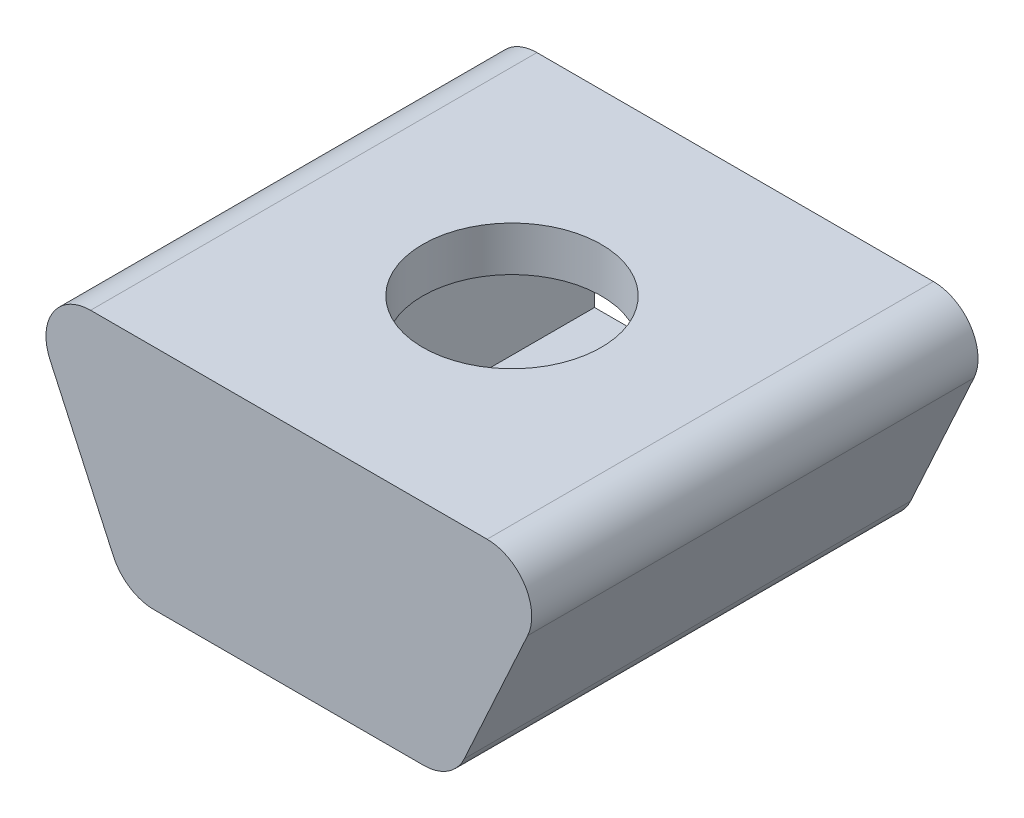
ISO-10303-21;
HEADER;
FILE_DESCRIPTION(('STEP AP214'),'2;1');
FILE_NAME('part.step','',(''),(''),'','','');
FILE_SCHEMA(('AUTOMOTIVE_DESIGN { 1 0 10303 214 1 1 1 1 }'));
ENDSEC;
DATA;
#1=APPLICATION_CONTEXT('core data for automotive mechanical design processes');
#2=APPLICATION_PROTOCOL_DEFINITION('international standard','automotive_design',2000,#1);
#3=PRODUCT_CONTEXT('',#1,'mechanical');
#4=PRODUCT('Part','Part','',(#3));
#5=PRODUCT_RELATED_PRODUCT_CATEGORY('part','',(#4));
#6=PRODUCT_DEFINITION_FORMATION('','',#4);
#7=PRODUCT_DEFINITION_CONTEXT('part definition',#1,'design');
#8=PRODUCT_DEFINITION('design','',#6,#7);
#9=PRODUCT_DEFINITION_SHAPE('','',#8);
#10=(LENGTH_UNIT() NAMED_UNIT(*) SI_UNIT(.MILLI.,.METRE.));
#11=(NAMED_UNIT(*) PLANE_ANGLE_UNIT() SI_UNIT($,.RADIAN.));
#12=(NAMED_UNIT(*) SI_UNIT($,.STERADIAN.) SOLID_ANGLE_UNIT());
#13=UNCERTAINTY_MEASURE_WITH_UNIT(LENGTH_MEASURE(1.E-05),#10,'distance_accuracy_value','');
#14=(GEOMETRIC_REPRESENTATION_CONTEXT(3) GLOBAL_UNCERTAINTY_ASSIGNED_CONTEXT((#13)) GLOBAL_UNIT_ASSIGNED_CONTEXT((#10,
#11,#12)) REPRESENTATION_CONTEXT('',''));
#15=CARTESIAN_POINT('',(0.,0.,0.));
#16=DIRECTION('',(0.,0.,1.));
#17=DIRECTION('',(1.,0.,0.));
#18=AXIS2_PLACEMENT_3D('',#15,#16,#17);
#19=CARTESIAN_POINT('',(-6.,2.65,-8.));
#20=DIRECTION('',(-0.909128622799582,-0.416515482553212,0.));
#21=DIRECTION('',(0.416515482553212,-0.909128622799582,0.));
#22=AXIS2_PLACEMENT_3D('',#19,#20,#21);
#23=PLANE('',#22);
#24=DIRECTION('',(0.416515482553212,-0.909128622799582,0.));
#25=VECTOR('',#24,1.);
#26=CARTESIAN_POINT('',(-6.,2.65,-8.));
#27=LINE('',#26,#25);
#28=CARTESIAN_POINT('',(-5.35102622999275,1.23348451744679,-8.));
#29=VERTEX_POINT('',#28);
#30=CARTESIAN_POINT('',(-3.93076735403873,-1.86651548255321,-8.));
#31=VERTEX_POINT('',#30);
#32=EDGE_CURVE('E158',#29,#31,#27,.T.);
#33=ORIENTED_EDGE('',*,*,#32,.T.);
#34=DIRECTION('',(0.,0.,1.));
#35=VECTOR('',#34,1.);
#36=CARTESIAN_POINT('',(-3.93076735403873,-1.86651548255321,-8.));
#37=LINE('',#36,#35);
#38=CARTESIAN_POINT('',(-3.93076735403873,-1.86651548255321,2.));
#39=VERTEX_POINT('',#38);
#40=EDGE_CURVE('E171',#31,#39,#37,.T.);
#41=ORIENTED_EDGE('',*,*,#40,.T.);
#42=DIRECTION('',(0.416515482553212,-0.909128622799582,0.));
#43=VECTOR('',#42,1.);
#44=CARTESIAN_POINT('',(-6.,2.65,2.));
#45=LINE('',#44,#43);
#46=CARTESIAN_POINT('',(-5.35102622999275,1.23348451744679,2.));
#47=VERTEX_POINT('',#46);
#48=EDGE_CURVE('E219',#47,#39,#45,.T.);
#49=ORIENTED_EDGE('',*,*,#48,.F.);
#50=DIRECTION('',(0.,0.,1.));
#51=VECTOR('',#50,1.);
#52=CARTESIAN_POINT('',(-5.35102622999275,1.23348451744679,-8.));
#53=LINE('',#52,#51);
#54=EDGE_CURVE('E169',#47,#29,#53,.F.);
#55=ORIENTED_EDGE('',*,*,#54,.T.);
#56=EDGE_LOOP('',(#33,#41,#49,#55));
#57=FACE_BOUND('',#56,.T.);
#58=ADVANCED_FACE('F33',(#57),#23,.T.);
#59=CARTESIAN_POINT('',(-6.,2.65,-8.));
#60=DIRECTION('',(0.,1.,0.));
#61=DIRECTION('',(-1.,0.,0.));
#62=AXIS2_PLACEMENT_3D('',#59,#60,#61);
#63=PLANE('',#62);
#64=CARTESIAN_POINT('',(0.,2.65,-3.));
#65=DIRECTION('',(0.,1.,0.));
#66=DIRECTION('',(-1.,0.,0.));
#67=AXIS2_PLACEMENT_3D('',#64,#65,#66);
#68=CIRCLE('',#67,2.);
#69=CARTESIAN_POINT('',(-2.,2.65,-3.));
#70=VERTEX_POINT('',#69);
#71=EDGE_CURVE('E277',#70,#70,#68,.T.);
#72=ORIENTED_EDGE('',*,*,#71,.F.);
#73=EDGE_LOOP('',(#72));
#74=FACE_BOUND('',#73,.T.);
#75=DIRECTION('',(-1.,0.,0.));
#76=VECTOR('',#75,1.);
#77=CARTESIAN_POINT('',(-6.,2.65,-8.));
#78=LINE('',#77,#76);
#79=CARTESIAN_POINT('',(4.44189760719316,2.65,-8.));
#80=VERTEX_POINT('',#79);
#81=CARTESIAN_POINT('',(-4.44189760719316,2.65,-8.));
#82=VERTEX_POINT('',#81);
#83=EDGE_CURVE('E166',#80,#82,#78,.T.);
#84=ORIENTED_EDGE('',*,*,#83,.T.);
#85=DIRECTION('',(0.,0.,1.));
#86=VECTOR('',#85,1.);
#87=CARTESIAN_POINT('',(-4.44189760719316,2.65,-8.));
#88=LINE('',#87,#86);
#89=CARTESIAN_POINT('',(-4.44189760719316,2.65,2.));
#90=VERTEX_POINT('',#89);
#91=EDGE_CURVE('E11',#82,#90,#88,.T.);
#92=ORIENTED_EDGE('',*,*,#91,.T.);
#93=DIRECTION('',(1.,0.,0.));
#94=VECTOR('',#93,1.);
#95=CARTESIAN_POINT('',(-6.,2.65,2.));
#96=LINE('',#95,#94);
#97=CARTESIAN_POINT('',(4.44189760719316,2.65,2.));
#98=VERTEX_POINT('',#97);
#99=EDGE_CURVE('E142',#90,#98,#96,.T.);
#100=ORIENTED_EDGE('',*,*,#99,.T.);
#101=DIRECTION('',(0.,0.,1.));
#102=VECTOR('',#101,1.);
#103=CARTESIAN_POINT('',(4.44189760719316,2.65,-8.));
#104=LINE('',#103,#102);
#105=EDGE_CURVE('E41',#98,#80,#104,.F.);
#106=ORIENTED_EDGE('',*,*,#105,.T.);
#107=EDGE_LOOP('',(#84,#92,#100,#106));
#108=FACE_BOUND('',#107,.T.);
#109=ADVANCED_FACE('F200',(#74,#108),#63,.T.);
#110=CARTESIAN_POINT('',(3.66344507504339,-2.45,-8.));
#111=DIRECTION('',(0.909128622799582,-0.416515482553212,0.));
#112=DIRECTION('',(0.416515482553212,0.909128622799582,0.));
#113=AXIS2_PLACEMENT_3D('',#110,#111,#112);
#114=PLANE('',#113);
#115=DIRECTION('',(0.416515482553212,0.909128622799582,0.));
#116=VECTOR('',#115,1.);
#117=CARTESIAN_POINT('',(3.66344507504339,-2.45,2.));
#118=LINE('',#117,#116);
#119=CARTESIAN_POINT('',(3.93076735403873,-1.86651548255321,2.));
#120=VERTEX_POINT('',#119);
#121=CARTESIAN_POINT('',(5.35102622999275,1.23348451744679,2.));
#122=VERTEX_POINT('',#121);
#123=EDGE_CURVE('E211',#120,#122,#118,.T.);
#124=ORIENTED_EDGE('',*,*,#123,.F.);
#125=DIRECTION('',(0.,0.,1.));
#126=VECTOR('',#125,1.);
#127=CARTESIAN_POINT('',(3.93076735403873,-1.86651548255321,-8.));
#128=LINE('',#127,#126);
#129=CARTESIAN_POINT('',(3.93076735403873,-1.86651548255321,-8.));
#130=VERTEX_POINT('',#129);
#131=EDGE_CURVE('E55',#120,#130,#128,.F.);
#132=ORIENTED_EDGE('',*,*,#131,.T.);
#133=DIRECTION('',(0.416515482553212,0.909128622799582,0.));
#134=VECTOR('',#133,1.);
#135=CARTESIAN_POINT('',(3.66344507504339,-2.45,-8.));
#136=LINE('',#135,#134);
#137=CARTESIAN_POINT('',(5.35102622999275,1.23348451744679,-8.));
#138=VERTEX_POINT('',#137);
#139=EDGE_CURVE('E164',#130,#138,#136,.T.);
#140=ORIENTED_EDGE('',*,*,#139,.T.);
#141=DIRECTION('',(0.,0.,1.));
#142=VECTOR('',#141,1.);
#143=CARTESIAN_POINT('',(5.35102622999275,1.23348451744679,-8.));
#144=LINE('',#143,#142);
#145=EDGE_CURVE('E194',#138,#122,#144,.T.);
#146=ORIENTED_EDGE('',*,*,#145,.T.);
#147=EDGE_LOOP('',(#124,#132,#140,#146));
#148=FACE_BOUND('',#147,.T.);
#149=ADVANCED_FACE('F210',(#148),#114,.T.);
#150=CARTESIAN_POINT('',(-3.66344507504339,-2.45,-8.));
#151=DIRECTION('',(0.,-1.,0.));
#152=DIRECTION('',(1.,0.,0.));
#153=AXIS2_PLACEMENT_3D('',#150,#151,#152);
#154=PLANE('',#153);
#155=DIRECTION('',(1.,0.,0.));
#156=VECTOR('',#155,1.);
#157=CARTESIAN_POINT('',(-3.66344507504339,-2.45,2.));
#158=LINE('',#157,#156);
#159=CARTESIAN_POINT('',(-3.02163873123915,-2.45,2.));
#160=VERTEX_POINT('',#159);
#161=CARTESIAN_POINT('',(3.02163873123915,-2.45,2.));
#162=VERTEX_POINT('',#161);
#163=EDGE_CURVE('E216',#160,#162,#158,.T.);
#164=ORIENTED_EDGE('',*,*,#163,.F.);
#165=DIRECTION('',(0.,0.,1.));
#166=VECTOR('',#165,1.);
#167=CARTESIAN_POINT('',(-3.02163873123915,-2.45,-8.));
#168=LINE('',#167,#166);
#169=CARTESIAN_POINT('',(-3.02163873123915,-2.45,-8.));
#170=VERTEX_POINT('',#169);
#171=EDGE_CURVE('E185',#160,#170,#168,.F.);
#172=ORIENTED_EDGE('',*,*,#171,.T.);
#173=DIRECTION('',(1.,0.,0.));
#174=VECTOR('',#173,1.);
#175=CARTESIAN_POINT('',(-3.66344507504339,-2.45,-8.));
#176=LINE('',#175,#174);
#177=CARTESIAN_POINT('',(3.02163873123915,-2.45,-8.));
#178=VERTEX_POINT('',#177);
#179=EDGE_CURVE('E161',#170,#178,#176,.T.);
#180=ORIENTED_EDGE('',*,*,#179,.T.);
#181=DIRECTION('',(0.,0.,1.));
#182=VECTOR('',#181,1.);
#183=CARTESIAN_POINT('',(3.02163873123915,-2.45,-8.));
#184=LINE('',#183,#182);
#185=EDGE_CURVE('E182',#178,#162,#184,.T.);
#186=ORIENTED_EDGE('',*,*,#185,.T.);
#187=EDGE_LOOP('',(#164,#172,#180,#186));
#188=FACE_BOUND('',#187,.T.);
#189=ADVANCED_FACE('F239',(#188),#154,.T.);
#190=CARTESIAN_POINT('',(0.,0.,-8.));
#191=DIRECTION('',(0.,0.,1.));
#192=DIRECTION('',(1.,0.,0.));
#193=AXIS2_PLACEMENT_3D('',#190,#191,#192);
#194=PLANE('',#193);
#195=DIRECTION('',(1.,0.,0.));
#196=VECTOR('',#195,1.);
#197=CARTESIAN_POINT('',(-3.15,-1.65,-8.));
#198=LINE('',#197,#196);
#199=CARTESIAN_POINT('',(-3.15,-1.65,-8.));
#200=VERTEX_POINT('',#199);
#201=CARTESIAN_POINT('',(3.15,-1.65,-8.));
#202=VERTEX_POINT('',#201);
#203=EDGE_CURVE('E149',#200,#202,#198,.T.);
#204=ORIENTED_EDGE('',*,*,#203,.T.);
#205=DIRECTION('',(0.,1.,0.));
#206=VECTOR('',#205,1.);
#207=CARTESIAN_POINT('',(3.15,-1.65,-8.));
#208=LINE('',#207,#206);
#209=CARTESIAN_POINT('',(3.15,1.65,-8.));
#210=VERTEX_POINT('',#209);
#211=EDGE_CURVE('E223',#202,#210,#208,.T.);
#212=ORIENTED_EDGE('',*,*,#211,.T.);
#213=DIRECTION('',(-1.,0.,0.));
#214=VECTOR('',#213,1.);
#215=CARTESIAN_POINT('',(-3.15,1.65,-8.));
#216=LINE('',#215,#214);
#217=CARTESIAN_POINT('',(-3.15,1.65,-8.));
#218=VERTEX_POINT('',#217);
#219=EDGE_CURVE('E146',#210,#218,#216,.T.);
#220=ORIENTED_EDGE('',*,*,#219,.T.);
#221=DIRECTION('',(0.,-1.,0.));
#222=VECTOR('',#221,1.);
#223=CARTESIAN_POINT('',(-3.15,-1.65,-8.));
#224=LINE('',#223,#222);
#225=EDGE_CURVE('E154',#218,#200,#224,.T.);
#226=ORIENTED_EDGE('',*,*,#225,.T.);
#227=EDGE_LOOP('',(#204,#212,#220,#226));
#228=FACE_BOUND('',#227,.T.);
#229=ORIENTED_EDGE('',*,*,#179,.F.);
#230=CARTESIAN_POINT('',(-3.02163873123915,-1.45,-8.));
#231=DIRECTION('',(0.,0.,1.));
#232=DIRECTION('',(1.,0.,0.));
#233=AXIS2_PLACEMENT_3D('',#230,#231,#232);
#234=CIRCLE('',#233,1.);
#235=EDGE_CURVE('E192',#170,#31,#234,.F.);
#236=ORIENTED_EDGE('',*,*,#235,.T.);
#237=ORIENTED_EDGE('',*,*,#32,.F.);
#238=CARTESIAN_POINT('',(-4.44189760719316,1.65,-8.));
#239=DIRECTION('',(0.,0.,1.));
#240=DIRECTION('',(1.,0.,0.));
#241=AXIS2_PLACEMENT_3D('',#238,#239,#240);
#242=CIRCLE('',#241,1.);
#243=EDGE_CURVE('E188',#29,#82,#242,.F.);
#244=ORIENTED_EDGE('',*,*,#243,.T.);
#245=ORIENTED_EDGE('',*,*,#83,.F.);
#246=CARTESIAN_POINT('',(4.44189760719316,1.65,-8.));
#247=DIRECTION('',(0.,0.,1.));
#248=DIRECTION('',(1.,0.,0.));
#249=AXIS2_PLACEMENT_3D('',#246,#247,#248);
#250=CIRCLE('',#249,1.);
#251=EDGE_CURVE('E48',#80,#138,#250,.F.);
#252=ORIENTED_EDGE('',*,*,#251,.T.);
#253=ORIENTED_EDGE('',*,*,#139,.F.);
#254=CARTESIAN_POINT('',(3.02163873123915,-1.45,-8.));
#255=DIRECTION('',(0.,0.,1.));
#256=DIRECTION('',(1.,0.,0.));
#257=AXIS2_PLACEMENT_3D('',#254,#255,#256);
#258=CIRCLE('',#257,1.);
#259=EDGE_CURVE('E190',#130,#178,#258,.F.);
#260=ORIENTED_EDGE('',*,*,#259,.T.);
#261=EDGE_LOOP('',(#229,#236,#237,#244,#245,#252,#253,#260));
#262=FACE_BOUND('',#261,.T.);
#263=ADVANCED_FACE('F205',(#228,#262),#194,.F.);
#264=CARTESIAN_POINT('',(3.15,-1.65,-8.));
#265=DIRECTION('',(1.,0.,0.));
#266=DIRECTION('',(0.,1.,0.));
#267=AXIS2_PLACEMENT_3D('',#264,#265,#266);
#268=PLANE('',#267);
#269=DIRECTION('',(0.,1.,0.));
#270=VECTOR('',#269,1.);
#271=CARTESIAN_POINT('',(3.15,-1.65,0.));
#272=LINE('',#271,#270);
#273=CARTESIAN_POINT('',(3.15,-1.65,0.));
#274=VERTEX_POINT('',#273);
#275=CARTESIAN_POINT('',(3.15,1.65,0.));
#276=VERTEX_POINT('',#275);
#277=EDGE_CURVE('E126',#274,#276,#272,.T.);
#278=ORIENTED_EDGE('',*,*,#277,.T.);
#279=DIRECTION('',(0.,0.,1.));
#280=VECTOR('',#279,1.);
#281=CARTESIAN_POINT('',(3.15,1.65,-8.));
#282=LINE('',#281,#280);
#283=EDGE_CURVE('E138',#210,#276,#282,.T.);
#284=ORIENTED_EDGE('',*,*,#283,.F.);
#285=ORIENTED_EDGE('',*,*,#211,.F.);
#286=DIRECTION('',(0.,0.,1.));
#287=VECTOR('',#286,1.);
#288=CARTESIAN_POINT('',(3.15,-1.65,-8.));
#289=LINE('',#288,#287);
#290=EDGE_CURVE('E140',#202,#274,#289,.T.);
#291=ORIENTED_EDGE('',*,*,#290,.T.);
#292=EDGE_LOOP('',(#278,#284,#285,#291));
#293=FACE_BOUND('',#292,.T.);
#294=ADVANCED_FACE('F136',(#293),#268,.F.);
#295=CARTESIAN_POINT('',(-3.15,-1.65,-8.));
#296=DIRECTION('',(0.,-1.,0.));
#297=DIRECTION('',(0.,0.,-1.));
#298=AXIS2_PLACEMENT_3D('',#295,#296,#297);
#299=PLANE('',#298);
#300=DIRECTION('',(1.,0.,0.));
#301=VECTOR('',#300,1.);
#302=CARTESIAN_POINT('',(-3.15,-1.65,0.));
#303=LINE('',#302,#301);
#304=CARTESIAN_POINT('',(-3.15,-1.65,0.));
#305=VERTEX_POINT('',#304);
#306=EDGE_CURVE('E225',#305,#274,#303,.T.);
#307=ORIENTED_EDGE('',*,*,#306,.T.);
#308=ORIENTED_EDGE('',*,*,#290,.F.);
#309=ORIENTED_EDGE('',*,*,#203,.F.);
#310=DIRECTION('',(0.,0.,1.));
#311=VECTOR('',#310,1.);
#312=CARTESIAN_POINT('',(-3.15,-1.65,-8.));
#313=LINE('',#312,#311);
#314=EDGE_CURVE('E151',#200,#305,#313,.T.);
#315=ORIENTED_EDGE('',*,*,#314,.T.);
#316=EDGE_LOOP('',(#307,#308,#309,#315));
#317=FACE_BOUND('',#316,.T.);
#318=ADVANCED_FACE('F234',(#317),#299,.F.);
#319=CARTESIAN_POINT('',(-3.15,-1.65,-8.));
#320=DIRECTION('',(-1.,0.,0.));
#321=DIRECTION('',(0.,0.,1.));
#322=AXIS2_PLACEMENT_3D('',#319,#320,#321);
#323=PLANE('',#322);
#324=DIRECTION('',(0.,-1.,0.));
#325=VECTOR('',#324,1.);
#326=CARTESIAN_POINT('',(-3.15,-1.65,0.));
#327=LINE('',#326,#325);
#328=CARTESIAN_POINT('',(-3.15,1.65,0.));
#329=VERTEX_POINT('',#328);
#330=EDGE_CURVE('E129',#329,#305,#327,.T.);
#331=ORIENTED_EDGE('',*,*,#330,.T.);
#332=ORIENTED_EDGE('',*,*,#314,.F.);
#333=ORIENTED_EDGE('',*,*,#225,.F.);
#334=DIRECTION('',(0.,0.,1.));
#335=VECTOR('',#334,1.);
#336=CARTESIAN_POINT('',(-3.15,1.65,-8.));
#337=LINE('',#336,#335);
#338=EDGE_CURVE('E148',#218,#329,#337,.T.);
#339=ORIENTED_EDGE('',*,*,#338,.T.);
#340=EDGE_LOOP('',(#331,#332,#333,#339));
#341=FACE_BOUND('',#340,.T.);
#342=ADVANCED_FACE('F236',(#341),#323,.F.);
#343=CARTESIAN_POINT('',(-3.15,1.65,-8.));
#344=DIRECTION('',(0.,1.,0.));
#345=DIRECTION('',(0.,0.,1.));
#346=AXIS2_PLACEMENT_3D('',#343,#344,#345);
#347=PLANE('',#346);
#348=CARTESIAN_POINT('',(0.,1.65,-3.));
#349=DIRECTION('',(0.,1.,0.));
#350=DIRECTION('',(0.,0.,1.));
#351=AXIS2_PLACEMENT_3D('',#348,#349,#350);
#352=CIRCLE('',#351,2.);
#353=CARTESIAN_POINT('',(-2.,1.65,-3.));
#354=VERTEX_POINT('',#353);
#355=EDGE_CURVE('E275',#354,#354,#352,.F.);
#356=ORIENTED_EDGE('',*,*,#355,.F.);
#357=EDGE_LOOP('',(#356));
#358=FACE_BOUND('',#357,.T.);
#359=DIRECTION('',(-1.,0.,0.));
#360=VECTOR('',#359,1.);
#361=CARTESIAN_POINT('',(-3.15,1.65,0.));
#362=LINE('',#361,#360);
#363=EDGE_CURVE('E123',#276,#329,#362,.T.);
#364=ORIENTED_EDGE('',*,*,#363,.T.);
#365=ORIENTED_EDGE('',*,*,#338,.F.);
#366=ORIENTED_EDGE('',*,*,#219,.F.);
#367=ORIENTED_EDGE('',*,*,#283,.T.);
#368=EDGE_LOOP('',(#364,#365,#366,#367));
#369=FACE_BOUND('',#368,.T.);
#370=ADVANCED_FACE('F144',(#358,#369),#347,.F.);
#371=CARTESIAN_POINT('',(0.,0.,0.));
#372=DIRECTION('',(0.,0.,1.));
#373=DIRECTION('',(1.,0.,0.));
#374=AXIS2_PLACEMENT_3D('',#371,#372,#373);
#375=PLANE('',#374);
#376=ORIENTED_EDGE('',*,*,#363,.F.);
#377=ORIENTED_EDGE('',*,*,#277,.F.);
#378=ORIENTED_EDGE('',*,*,#306,.F.);
#379=ORIENTED_EDGE('',*,*,#330,.F.);
#380=EDGE_LOOP('',(#376,#377,#378,#379));
#381=FACE_BOUND('',#380,.T.);
#382=ADVANCED_FACE('F125',(#381),#375,.F.);
#383=CARTESIAN_POINT('',(0.,0.,2.));
#384=DIRECTION('',(0.,0.,1.));
#385=DIRECTION('',(1.,0.,0.));
#386=AXIS2_PLACEMENT_3D('',#383,#384,#385);
#387=PLANE('',#386);
#388=ORIENTED_EDGE('',*,*,#48,.T.);
#389=CARTESIAN_POINT('',(-3.02163873123915,-1.45,2.));
#390=DIRECTION('',(0.,0.,1.));
#391=DIRECTION('',(1.,0.,0.));
#392=AXIS2_PLACEMENT_3D('',#389,#390,#391);
#393=CIRCLE('',#392,1.);
#394=EDGE_CURVE('E180',#39,#160,#393,.T.);
#395=ORIENTED_EDGE('',*,*,#394,.T.);
#396=ORIENTED_EDGE('',*,*,#163,.T.);
#397=CARTESIAN_POINT('',(3.02163873123915,-1.45,2.));
#398=DIRECTION('',(0.,0.,1.));
#399=DIRECTION('',(1.,0.,0.));
#400=AXIS2_PLACEMENT_3D('',#397,#398,#399);
#401=CIRCLE('',#400,1.);
#402=EDGE_CURVE('E178',#162,#120,#401,.T.);
#403=ORIENTED_EDGE('',*,*,#402,.T.);
#404=ORIENTED_EDGE('',*,*,#123,.T.);
#405=CARTESIAN_POINT('',(4.44189760719316,1.65,2.));
#406=DIRECTION('',(0.,0.,1.));
#407=DIRECTION('',(1.,0.,0.));
#408=AXIS2_PLACEMENT_3D('',#405,#406,#407);
#409=CIRCLE('',#408,1.);
#410=EDGE_CURVE('E174',#122,#98,#409,.T.);
#411=ORIENTED_EDGE('',*,*,#410,.T.);
#412=ORIENTED_EDGE('',*,*,#99,.F.);
#413=CARTESIAN_POINT('',(-4.44189760719316,1.65,2.));
#414=DIRECTION('',(0.,0.,1.));
#415=DIRECTION('',(1.,0.,0.));
#416=AXIS2_PLACEMENT_3D('',#413,#414,#415);
#417=CIRCLE('',#416,1.);
#418=EDGE_CURVE('E176',#90,#47,#417,.T.);
#419=ORIENTED_EDGE('',*,*,#418,.T.);
#420=EDGE_LOOP('',(#388,#395,#396,#403,#404,#411,#412,#419));
#421=FACE_BOUND('',#420,.T.);
#422=ADVANCED_FACE('F214',(#421),#387,.T.);
#423=CARTESIAN_POINT('',(0.,-4.00685424949238,-3.));
#424=DIRECTION('',(0.,1.,0.));
#425=DIRECTION('',(-1.,0.,0.));
#426=AXIS2_PLACEMENT_3D('',#423,#424,#425);
#427=CYLINDRICAL_SURFACE('',#426,2.);
#428=CARTESIAN_POINT('',(-2.,1.65,-3.));
#429=CARTESIAN_POINT('',(-2.,1.66041666666667,-3.));
#430=CARTESIAN_POINT('',(-2.,1.67083333333333,-3.));
#431=CARTESIAN_POINT('',(-2.,1.69166666666667,-3.));
#432=CARTESIAN_POINT('',(-2.,1.70208333333333,-3.));
#433=CARTESIAN_POINT('',(-2.,1.72291666666667,-3.));
#434=CARTESIAN_POINT('',(-2.,1.73333333333333,-3.));
#435=CARTESIAN_POINT('',(-2.,1.75416666666667,-3.));
#436=CARTESIAN_POINT('',(-2.,1.76458333333333,-3.));
#437=CARTESIAN_POINT('',(-2.,1.78541666666667,-3.));
#438=CARTESIAN_POINT('',(-2.,1.79583333333333,-3.));
#439=CARTESIAN_POINT('',(-2.,1.81666666666667,-3.));
#440=CARTESIAN_POINT('',(-2.,1.82708333333333,-3.));
#441=CARTESIAN_POINT('',(-2.,1.84791666666667,-3.));
#442=CARTESIAN_POINT('',(-2.,1.85833333333333,-3.));
#443=CARTESIAN_POINT('',(-2.,1.87916666666667,-3.));
#444=CARTESIAN_POINT('',(-2.,1.88958333333333,-3.));
#445=CARTESIAN_POINT('',(-2.,1.91041666666667,-3.));
#446=CARTESIAN_POINT('',(-2.,1.92083333333333,-3.));
#447=CARTESIAN_POINT('',(-2.,1.94166666666667,-3.));
#448=CARTESIAN_POINT('',(-2.,1.95208333333333,-3.));
#449=CARTESIAN_POINT('',(-2.,1.97291666666667,-3.));
#450=CARTESIAN_POINT('',(-2.,1.98333333333333,-3.));
#451=CARTESIAN_POINT('',(-2.,2.00416666666667,-3.));
#452=CARTESIAN_POINT('',(-2.,2.01458333333333,-3.));
#453=CARTESIAN_POINT('',(-2.,2.03541666666667,-3.));
#454=CARTESIAN_POINT('',(-2.,2.04583333333333,-3.));
#455=CARTESIAN_POINT('',(-2.,2.06666666666667,-3.));
#456=CARTESIAN_POINT('',(-2.,2.07708333333333,-3.));
#457=CARTESIAN_POINT('',(-2.,2.09791666666667,-3.));
#458=CARTESIAN_POINT('',(-2.,2.10833333333333,-3.));
#459=CARTESIAN_POINT('',(-2.,2.12916666666667,-3.));
#460=CARTESIAN_POINT('',(-2.,2.13958333333333,-3.));
#461=CARTESIAN_POINT('',(-2.,2.16041666666667,-3.));
#462=CARTESIAN_POINT('',(-2.,2.17083333333333,-3.));
#463=CARTESIAN_POINT('',(-2.,2.19166666666667,-3.));
#464=CARTESIAN_POINT('',(-2.,2.20208333333333,-3.));
#465=CARTESIAN_POINT('',(-2.,2.22291666666667,-3.));
#466=CARTESIAN_POINT('',(-2.,2.23333333333333,-3.));
#467=CARTESIAN_POINT('',(-2.,2.25416666666667,-3.));
#468=CARTESIAN_POINT('',(-2.,2.26458333333333,-3.));
#469=CARTESIAN_POINT('',(-2.,2.28541666666667,-3.));
#470=CARTESIAN_POINT('',(-2.,2.29583333333333,-3.));
#471=CARTESIAN_POINT('',(-2.,2.31666666666667,-3.));
#472=CARTESIAN_POINT('',(-2.,2.32708333333333,-3.));
#473=CARTESIAN_POINT('',(-2.,2.34791666666667,-3.));
#474=CARTESIAN_POINT('',(-2.,2.35833333333333,-3.));
#475=CARTESIAN_POINT('',(-2.,2.37916666666667,-3.));
#476=CARTESIAN_POINT('',(-2.,2.38958333333333,-3.));
#477=CARTESIAN_POINT('',(-2.,2.41041666666667,-3.));
#478=CARTESIAN_POINT('',(-2.,2.42083333333333,-3.));
#479=CARTESIAN_POINT('',(-2.,2.44166666666667,-3.));
#480=CARTESIAN_POINT('',(-2.,2.45208333333333,-3.));
#481=CARTESIAN_POINT('',(-2.,2.47291666666667,-3.));
#482=CARTESIAN_POINT('',(-2.,2.48333333333333,-3.));
#483=CARTESIAN_POINT('',(-2.,2.50416666666667,-3.));
#484=CARTESIAN_POINT('',(-2.,2.51458333333333,-3.));
#485=CARTESIAN_POINT('',(-2.,2.53541666666667,-3.));
#486=CARTESIAN_POINT('',(-2.,2.54583333333333,-3.));
#487=CARTESIAN_POINT('',(-2.,2.56666666666667,-3.));
#488=CARTESIAN_POINT('',(-2.,2.57708333333333,-3.));
#489=CARTESIAN_POINT('',(-2.,2.59791666666667,-3.));
#490=CARTESIAN_POINT('',(-2.,2.60833333333333,-3.));
#491=CARTESIAN_POINT('',(-2.,2.62916666666667,-3.));
#492=CARTESIAN_POINT('',(-2.,2.63958333333333,-3.));
#493=CARTESIAN_POINT('',(-2.,2.65,-3.));
#494=B_SPLINE_CURVE_WITH_KNOTS('',3,(#428,#429,#430,#431,#432,#433,#434,#435,#436,#437,#438,
#439,#440,#441,#442,#443,#444,#445,#446,#447,#448,#449,#450,#451,#452,#453,#454,#455,#456,#457,
#458,#459,#460,#461,#462,#463,#464,#465,#466,#467,#468,#469,#470,#471,#472,#473,#474,#475,#476,
#477,#478,#479,#480,#481,#482,#483,#484,#485,#486,#487,#488,#489,#490,#491,#492,#493),
.UNSPECIFIED.,.F.,.F.,(4,2,2,2,2,2,2,2,2,2,2,2,2,2,2,2,2,2,2,2,2,2,2,2,2,2,2,2,2,2,2,2,4),(0.,
0.03125,0.0625000000000001,0.0937500000000001,0.125,0.15625,0.1875,0.21875,0.25,0.28125,0.3125,
0.34375,0.375,0.40625,0.4375,0.46875,0.5,0.53125,0.5625,0.593750000000001,0.625000000000001,
0.656250000000001,0.687500000000001,0.718750000000001,0.750000000000001,0.781250000000001,
0.812500000000001,0.843750000000001,0.875000000000001,0.906250000000001,0.937500000000001,
0.968750000000001,1.),.UNSPECIFIED.);
#495=EDGE_CURVE('BSEAM262',#354,#70,#494,.T.);
#496=ORIENTED_EDGE('',*,*,#355,.T.);
#497=ORIENTED_EDGE('',*,*,#71,.T.);
#498=ORIENTED_EDGE('',*,*,#495,.T.);
#499=ORIENTED_EDGE('',*,*,#495,.F.);
#500=EDGE_LOOP('',(#496,#498,#497,#499));
#501=FACE_BOUND('',#500,.T.);
#502=ADVANCED_FACE('F262',(#501),#427,.F.);
#503=CARTESIAN_POINT('',(-3.02163873123915,-1.45,-8.));
#504=DIRECTION('',(0.,0.,1.));
#505=DIRECTION('',(1.,0.,0.));
#506=AXIS2_PLACEMENT_3D('',#503,#504,#505);
#507=CYLINDRICAL_SURFACE('',#506,1.);
#508=ORIENTED_EDGE('',*,*,#235,.F.);
#509=ORIENTED_EDGE('',*,*,#171,.F.);
#510=ORIENTED_EDGE('',*,*,#394,.F.);
#511=ORIENTED_EDGE('',*,*,#40,.F.);
#512=EDGE_LOOP('',(#508,#509,#510,#511));
#513=FACE_BOUND('',#512,.T.);
#514=ADVANCED_FACE('F258',(#513),#507,.T.);
#515=CARTESIAN_POINT('',(3.02163873123915,-1.45,-8.));
#516=DIRECTION('',(0.,0.,1.));
#517=DIRECTION('',(1.,0.,0.));
#518=AXIS2_PLACEMENT_3D('',#515,#516,#517);
#519=CYLINDRICAL_SURFACE('',#518,1.);
#520=ORIENTED_EDGE('',*,*,#259,.F.);
#521=ORIENTED_EDGE('',*,*,#131,.F.);
#522=ORIENTED_EDGE('',*,*,#402,.F.);
#523=ORIENTED_EDGE('',*,*,#185,.F.);
#524=EDGE_LOOP('',(#520,#521,#522,#523));
#525=FACE_BOUND('',#524,.T.);
#526=ADVANCED_FACE('F261',(#525),#519,.T.);
#527=CARTESIAN_POINT('',(-4.44189760719316,1.65,-8.));
#528=DIRECTION('',(0.,0.,1.));
#529=DIRECTION('',(1.,0.,0.));
#530=AXIS2_PLACEMENT_3D('',#527,#528,#529);
#531=CYLINDRICAL_SURFACE('',#530,1.);
#532=ORIENTED_EDGE('',*,*,#243,.F.);
#533=ORIENTED_EDGE('',*,*,#54,.F.);
#534=ORIENTED_EDGE('',*,*,#418,.F.);
#535=ORIENTED_EDGE('',*,*,#91,.F.);
#536=EDGE_LOOP('',(#532,#533,#534,#535));
#537=FACE_BOUND('',#536,.T.);
#538=ADVANCED_FACE('F265',(#537),#531,.T.);
#539=CARTESIAN_POINT('',(4.44189760719316,1.65,-8.));
#540=DIRECTION('',(0.,0.,1.));
#541=DIRECTION('',(1.,0.,0.));
#542=AXIS2_PLACEMENT_3D('',#539,#540,#541);
#543=CYLINDRICAL_SURFACE('',#542,1.);
#544=ORIENTED_EDGE('',*,*,#251,.F.);
#545=ORIENTED_EDGE('',*,*,#105,.F.);
#546=ORIENTED_EDGE('',*,*,#410,.F.);
#547=ORIENTED_EDGE('',*,*,#145,.F.);
#548=EDGE_LOOP('',(#544,#545,#546,#547));
#549=FACE_BOUND('',#548,.T.);
#550=ADVANCED_FACE('F35',(#549),#543,.T.);
#551=CLOSED_SHELL('',(#58,#109,#149,#189,#263,#294,#318,#342,#370,#382,#422,#502,#514,#526,#538,#550));
#552=MANIFOLD_SOLID_BREP('B2',#551);
#553=ADVANCED_BREP_SHAPE_REPRESENTATION('',(#18,#552),#14);
#554=SHAPE_DEFINITION_REPRESENTATION(#9,#553);
ENDSEC;
END-ISO-10303-21;
